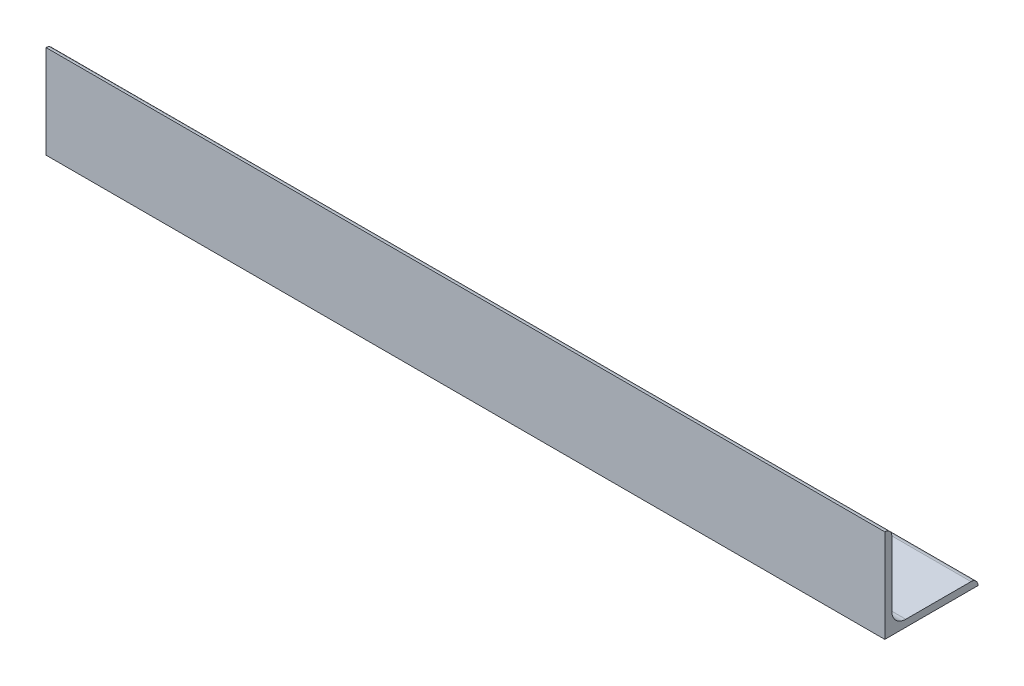
ISO-10303-21;
HEADER;
FILE_DESCRIPTION(('STEP AP214'),'2;1');
FILE_NAME('part.step','',(''),(''),'','','');
FILE_SCHEMA(('AUTOMOTIVE_DESIGN { 1 0 10303 214 1 1 1 1 }'));
ENDSEC;
DATA;
#1=APPLICATION_CONTEXT('core data for automotive mechanical design processes');
#2=APPLICATION_PROTOCOL_DEFINITION('international standard','automotive_design',2000,#1);
#3=PRODUCT_CONTEXT('',#1,'mechanical');
#4=PRODUCT('Part','Part','',(#3));
#5=PRODUCT_RELATED_PRODUCT_CATEGORY('part','',(#4));
#6=PRODUCT_DEFINITION_FORMATION('','',#4);
#7=PRODUCT_DEFINITION_CONTEXT('part definition',#1,'design');
#8=PRODUCT_DEFINITION('design','',#6,#7);
#9=PRODUCT_DEFINITION_SHAPE('','',#8);
#10=(LENGTH_UNIT() NAMED_UNIT(*) SI_UNIT(.MILLI.,.METRE.));
#11=(NAMED_UNIT(*) PLANE_ANGLE_UNIT() SI_UNIT($,.RADIAN.));
#12=(NAMED_UNIT(*) SI_UNIT($,.STERADIAN.) SOLID_ANGLE_UNIT());
#13=UNCERTAINTY_MEASURE_WITH_UNIT(LENGTH_MEASURE(1.E-05),#10,'distance_accuracy_value','');
#14=(GEOMETRIC_REPRESENTATION_CONTEXT(3) GLOBAL_UNCERTAINTY_ASSIGNED_CONTEXT((#13)) GLOBAL_UNIT_ASSIGNED_CONTEXT((#10,
#11,#12)) REPRESENTATION_CONTEXT('',''));
#15=CARTESIAN_POINT('',(0.,0.,0.));
#16=DIRECTION('',(0.,0.,1.));
#17=DIRECTION('',(1.,0.,0.));
#18=AXIS2_PLACEMENT_3D('',#15,#16,#17);
#19=CARTESIAN_POINT('',(360.,0.,-40.));
#20=DIRECTION('',(0.,1.,0.));
#21=DIRECTION('',(0.,0.,1.));
#22=AXIS2_PLACEMENT_3D('',#19,#20,#21);
#23=PLANE('',#22);
#24=DIRECTION('',(0.,0.,-1.));
#25=VECTOR('',#24,1.);
#26=CARTESIAN_POINT('',(0.,0.,-40.));
#27=LINE('',#26,#25);
#28=CARTESIAN_POINT('',(0.,0.,0.));
#29=VERTEX_POINT('',#28);
#30=CARTESIAN_POINT('',(0.,0.,-40.));
#31=VERTEX_POINT('',#30);
#32=EDGE_CURVE('E154',#29,#31,#27,.T.);
#33=ORIENTED_EDGE('',*,*,#32,.T.);
#34=DIRECTION('',(-1.,0.,0.));
#35=VECTOR('',#34,1.);
#36=CARTESIAN_POINT('',(360.,0.,-40.));
#37=LINE('',#36,#35);
#38=CARTESIAN_POINT('',(360.,0.,-40.));
#39=VERTEX_POINT('',#38);
#40=EDGE_CURVE('E13',#39,#31,#37,.T.);
#41=ORIENTED_EDGE('',*,*,#40,.F.);
#42=DIRECTION('',(0.,0.,-1.));
#43=VECTOR('',#42,1.);
#44=CARTESIAN_POINT('',(360.,0.,-40.));
#45=LINE('',#44,#43);
#46=CARTESIAN_POINT('',(360.,0.,0.));
#47=VERTEX_POINT('',#46);
#48=EDGE_CURVE('E166',#47,#39,#45,.T.);
#49=ORIENTED_EDGE('',*,*,#48,.F.);
#50=DIRECTION('',(-1.,0.,0.));
#51=VECTOR('',#50,1.);
#52=CARTESIAN_POINT('',(360.,0.,0.));
#53=LINE('',#52,#51);
#54=EDGE_CURVE('E150',#47,#29,#53,.T.);
#55=ORIENTED_EDGE('',*,*,#54,.T.);
#56=EDGE_LOOP('',(#33,#41,#49,#55));
#57=FACE_BOUND('',#56,.T.);
#58=ADVANCED_FACE('F64',(#57),#23,.F.);
#59=CARTESIAN_POINT('',(360.,0.,-37.));
#60=DIRECTION('',(-1.,0.,0.));
#61=DIRECTION('',(0.,0.,1.));
#62=AXIS2_PLACEMENT_3D('',#59,#60,#61);
#63=CYLINDRICAL_SURFACE('',#62,3.);
#64=CARTESIAN_POINT('',(0.,0.,-37.));
#65=DIRECTION('',(1.,0.,0.));
#66=DIRECTION('',(0.,0.,-1.));
#67=AXIS2_PLACEMENT_3D('',#64,#65,#66);
#68=CIRCLE('',#67,3.);
#69=CARTESIAN_POINT('',(0.,3.,-37.));
#70=VERTEX_POINT('',#69);
#71=EDGE_CURVE('E157',#31,#70,#68,.T.);
#72=ORIENTED_EDGE('',*,*,#71,.T.);
#73=DIRECTION('',(-1.,0.,0.));
#74=VECTOR('',#73,1.);
#75=CARTESIAN_POINT('',(360.,3.,-37.));
#76=LINE('',#75,#74);
#77=CARTESIAN_POINT('',(360.,3.,-37.));
#78=VERTEX_POINT('',#77);
#79=EDGE_CURVE('E72',#78,#70,#76,.T.);
#80=ORIENTED_EDGE('',*,*,#79,.F.);
#81=CARTESIAN_POINT('',(360.,0.,-37.));
#82=DIRECTION('',(1.,0.,0.));
#83=DIRECTION('',(0.,0.,-1.));
#84=AXIS2_PLACEMENT_3D('',#81,#82,#83);
#85=CIRCLE('',#84,3.);
#86=EDGE_CURVE('E120',#39,#78,#85,.T.);
#87=ORIENTED_EDGE('',*,*,#86,.F.);
#88=ORIENTED_EDGE('',*,*,#40,.T.);
#89=EDGE_LOOP('',(#72,#80,#87,#88));
#90=FACE_BOUND('',#89,.T.);
#91=ADVANCED_FACE('F191',(#90),#63,.T.);
#92=CARTESIAN_POINT('',(360.,3.,-9.));
#93=DIRECTION('',(0.,-1.,0.));
#94=DIRECTION('',(0.,0.,-1.));
#95=AXIS2_PLACEMENT_3D('',#92,#93,#94);
#96=PLANE('',#95);
#97=DIRECTION('',(0.,0.,1.));
#98=VECTOR('',#97,1.);
#99=CARTESIAN_POINT('',(0.,3.,-9.));
#100=LINE('',#99,#98);
#101=CARTESIAN_POINT('',(0.,3.,-9.00000000000001));
#102=VERTEX_POINT('',#101);
#103=EDGE_CURVE('E159',#70,#102,#100,.T.);
#104=ORIENTED_EDGE('',*,*,#103,.T.);
#105=DIRECTION('',(-1.,0.,0.));
#106=VECTOR('',#105,1.);
#107=CARTESIAN_POINT('',(360.,3.,-9.00000000000001));
#108=LINE('',#107,#106);
#109=CARTESIAN_POINT('',(360.,3.,-9.00000000000001));
#110=VERTEX_POINT('',#109);
#111=EDGE_CURVE('E170',#110,#102,#108,.T.);
#112=ORIENTED_EDGE('',*,*,#111,.F.);
#113=DIRECTION('',(0.,0.,1.));
#114=VECTOR('',#113,1.);
#115=CARTESIAN_POINT('',(360.,3.,-9.));
#116=LINE('',#115,#114);
#117=EDGE_CURVE('E178',#78,#110,#116,.T.);
#118=ORIENTED_EDGE('',*,*,#117,.F.);
#119=ORIENTED_EDGE('',*,*,#79,.T.);
#120=EDGE_LOOP('',(#104,#112,#118,#119));
#121=FACE_BOUND('',#120,.T.);
#122=ADVANCED_FACE('F176',(#121),#96,.F.);
#123=CARTESIAN_POINT('',(360.,9.,-9.));
#124=DIRECTION('',(-1.,0.,0.));
#125=DIRECTION('',(0.,0.,1.));
#126=AXIS2_PLACEMENT_3D('',#123,#124,#125);
#127=CYLINDRICAL_SURFACE('',#126,6.);
#128=CARTESIAN_POINT('',(0.,9.,-9.));
#129=DIRECTION('',(-1.,0.,0.));
#130=DIRECTION('',(0.,0.,1.));
#131=AXIS2_PLACEMENT_3D('',#128,#129,#130);
#132=CIRCLE('',#131,6.);
#133=CARTESIAN_POINT('',(0.,9.,-3.));
#134=VERTEX_POINT('',#133);
#135=EDGE_CURVE('E161',#102,#134,#132,.T.);
#136=ORIENTED_EDGE('',*,*,#135,.T.);
#137=DIRECTION('',(-1.,0.,0.));
#138=VECTOR('',#137,1.);
#139=CARTESIAN_POINT('',(360.,9.,-3.));
#140=LINE('',#139,#138);
#141=CARTESIAN_POINT('',(360.,9.,-3.));
#142=VERTEX_POINT('',#141);
#143=EDGE_CURVE('E145',#142,#134,#140,.T.);
#144=ORIENTED_EDGE('',*,*,#143,.F.);
#145=CARTESIAN_POINT('',(360.,9.,-9.));
#146=DIRECTION('',(-1.,0.,0.));
#147=DIRECTION('',(0.,0.,1.));
#148=AXIS2_PLACEMENT_3D('',#145,#146,#147);
#149=CIRCLE('',#148,6.);
#150=EDGE_CURVE('E136',#110,#142,#149,.T.);
#151=ORIENTED_EDGE('',*,*,#150,.F.);
#152=ORIENTED_EDGE('',*,*,#111,.T.);
#153=EDGE_LOOP('',(#136,#144,#151,#152));
#154=FACE_BOUND('',#153,.T.);
#155=ADVANCED_FACE('F184',(#154),#127,.F.);
#156=CARTESIAN_POINT('',(360.,37.,-3.));
#157=DIRECTION('',(0.,0.,1.));
#158=DIRECTION('',(1.,0.,0.));
#159=AXIS2_PLACEMENT_3D('',#156,#157,#158);
#160=PLANE('',#159);
#161=DIRECTION('',(0.,1.,0.));
#162=VECTOR('',#161,1.);
#163=CARTESIAN_POINT('',(0.,37.,-3.));
#164=LINE('',#163,#162);
#165=CARTESIAN_POINT('',(0.,37.,-3.));
#166=VERTEX_POINT('',#165);
#167=EDGE_CURVE('E144',#134,#166,#164,.T.);
#168=ORIENTED_EDGE('',*,*,#167,.T.);
#169=DIRECTION('',(-1.,0.,0.));
#170=VECTOR('',#169,1.);
#171=CARTESIAN_POINT('',(360.,37.,-3.));
#172=LINE('',#171,#170);
#173=CARTESIAN_POINT('',(360.,37.,-3.));
#174=VERTEX_POINT('',#173);
#175=EDGE_CURVE('E141',#174,#166,#172,.T.);
#176=ORIENTED_EDGE('',*,*,#175,.F.);
#177=DIRECTION('',(0.,1.,0.));
#178=VECTOR('',#177,1.);
#179=CARTESIAN_POINT('',(360.,37.,-3.));
#180=LINE('',#179,#178);
#181=EDGE_CURVE('E130',#142,#174,#180,.T.);
#182=ORIENTED_EDGE('',*,*,#181,.F.);
#183=ORIENTED_EDGE('',*,*,#143,.T.);
#184=EDGE_LOOP('',(#168,#176,#182,#183));
#185=FACE_BOUND('',#184,.T.);
#186=ADVANCED_FACE('F142',(#185),#160,.F.);
#187=CARTESIAN_POINT('',(360.,37.,0.));
#188=DIRECTION('',(-1.,0.,0.));
#189=DIRECTION('',(0.,0.,1.));
#190=AXIS2_PLACEMENT_3D('',#187,#188,#189);
#191=CYLINDRICAL_SURFACE('',#190,3.);
#192=CARTESIAN_POINT('',(0.,37.,0.));
#193=DIRECTION('',(1.,0.,0.));
#194=DIRECTION('',(0.,0.,-1.));
#195=AXIS2_PLACEMENT_3D('',#192,#193,#194);
#196=CIRCLE('',#195,3.);
#197=CARTESIAN_POINT('',(0.,40.,0.));
#198=VERTEX_POINT('',#197);
#199=EDGE_CURVE('E106',#166,#198,#196,.T.);
#200=ORIENTED_EDGE('',*,*,#199,.T.);
#201=DIRECTION('',(-1.,0.,0.));
#202=VECTOR('',#201,1.);
#203=CARTESIAN_POINT('',(360.,40.,0.));
#204=LINE('',#203,#202);
#205=CARTESIAN_POINT('',(360.,40.,0.));
#206=VERTEX_POINT('',#205);
#207=EDGE_CURVE('E146',#206,#198,#204,.T.);
#208=ORIENTED_EDGE('',*,*,#207,.F.);
#209=CARTESIAN_POINT('',(360.,37.,0.));
#210=DIRECTION('',(1.,0.,0.));
#211=DIRECTION('',(0.,0.,-1.));
#212=AXIS2_PLACEMENT_3D('',#209,#210,#211);
#213=CIRCLE('',#212,3.);
#214=EDGE_CURVE('E134',#174,#206,#213,.T.);
#215=ORIENTED_EDGE('',*,*,#214,.F.);
#216=ORIENTED_EDGE('',*,*,#175,.T.);
#217=EDGE_LOOP('',(#200,#208,#215,#216));
#218=FACE_BOUND('',#217,.T.);
#219=ADVANCED_FACE('F148',(#218),#191,.T.);
#220=CARTESIAN_POINT('',(360.,40.,0.));
#221=DIRECTION('',(0.,0.,-1.));
#222=DIRECTION('',(-1.,0.,0.));
#223=AXIS2_PLACEMENT_3D('',#220,#221,#222);
#224=PLANE('',#223);
#225=DIRECTION('',(0.,-1.,0.));
#226=VECTOR('',#225,1.);
#227=CARTESIAN_POINT('',(0.,40.,0.));
#228=LINE('',#227,#226);
#229=EDGE_CURVE('E112',#198,#29,#228,.T.);
#230=ORIENTED_EDGE('',*,*,#229,.T.);
#231=ORIENTED_EDGE('',*,*,#54,.F.);
#232=DIRECTION('',(0.,-1.,0.));
#233=VECTOR('',#232,1.);
#234=CARTESIAN_POINT('',(360.,40.,0.));
#235=LINE('',#234,#233);
#236=EDGE_CURVE('E80',#206,#47,#235,.T.);
#237=ORIENTED_EDGE('',*,*,#236,.F.);
#238=ORIENTED_EDGE('',*,*,#207,.T.);
#239=EDGE_LOOP('',(#230,#231,#237,#238));
#240=FACE_BOUND('',#239,.T.);
#241=ADVANCED_FACE('F205',(#240),#224,.F.);
#242=CARTESIAN_POINT('',(360.,37.,0.));
#243=DIRECTION('',(1.,0.,0.));
#244=DIRECTION('',(0.,0.,-1.));
#245=AXIS2_PLACEMENT_3D('',#242,#243,#244);
#246=PLANE('',#245);
#247=ORIENTED_EDGE('',*,*,#48,.T.);
#248=ORIENTED_EDGE('',*,*,#86,.T.);
#249=ORIENTED_EDGE('',*,*,#117,.T.);
#250=ORIENTED_EDGE('',*,*,#150,.T.);
#251=ORIENTED_EDGE('',*,*,#181,.T.);
#252=ORIENTED_EDGE('',*,*,#214,.T.);
#253=ORIENTED_EDGE('',*,*,#236,.T.);
#254=EDGE_LOOP('',(#247,#248,#249,#250,#251,#252,#253));
#255=FACE_BOUND('',#254,.T.);
#256=ADVANCED_FACE('F132',(#255),#246,.T.);
#257=CARTESIAN_POINT('',(0.,37.,0.));
#258=DIRECTION('',(1.,0.,0.));
#259=DIRECTION('',(0.,0.,-1.));
#260=AXIS2_PLACEMENT_3D('',#257,#258,#259);
#261=PLANE('',#260);
#262=ORIENTED_EDGE('',*,*,#32,.F.);
#263=ORIENTED_EDGE('',*,*,#229,.F.);
#264=ORIENTED_EDGE('',*,*,#199,.F.);
#265=ORIENTED_EDGE('',*,*,#167,.F.);
#266=ORIENTED_EDGE('',*,*,#135,.F.);
#267=ORIENTED_EDGE('',*,*,#103,.F.);
#268=ORIENTED_EDGE('',*,*,#71,.F.);
#269=EDGE_LOOP('',(#262,#263,#264,#265,#266,#267,#268));
#270=FACE_BOUND('',#269,.T.);
#271=ADVANCED_FACE('F182',(#270),#261,.F.);
#272=CLOSED_SHELL('',(#58,#91,#122,#155,#186,#219,#241,#256,#271));
#273=MANIFOLD_SOLID_BREP('B2',#272);
#274=ADVANCED_BREP_SHAPE_REPRESENTATION('',(#18,#273),#14);
#275=SHAPE_DEFINITION_REPRESENTATION(#9,#274);
ENDSEC;
END-ISO-10303-21;
